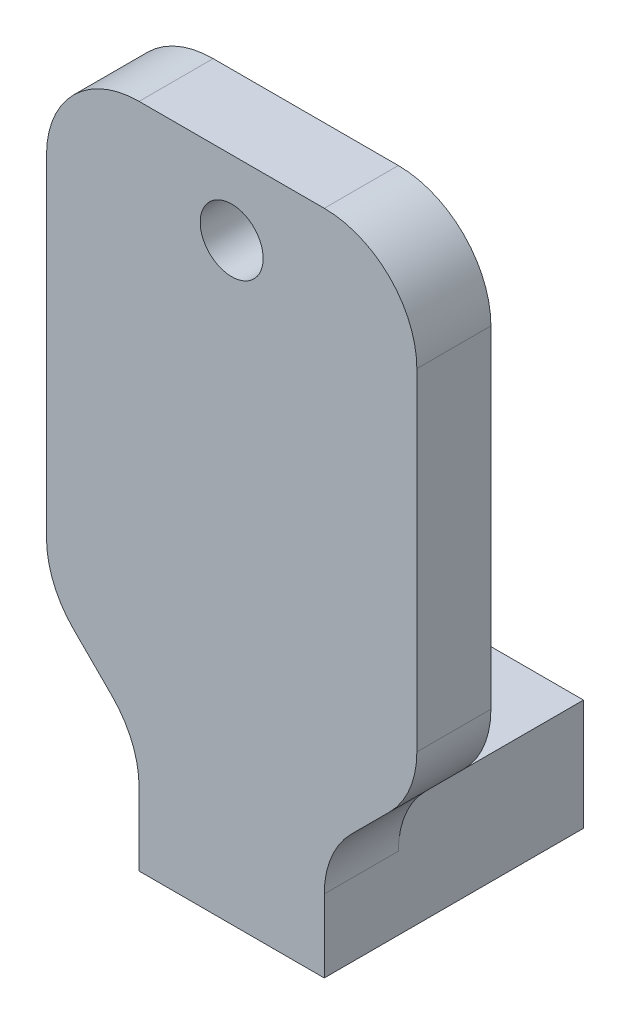
ISO-10303-21;
HEADER;
FILE_DESCRIPTION(('STEP AP214'),'2;1');
FILE_NAME('part.step','',(''),(''),'','','');
FILE_SCHEMA(('AUTOMOTIVE_DESIGN { 1 0 10303 214 1 1 1 1 }'));
ENDSEC;
DATA;
#1=APPLICATION_CONTEXT('core data for automotive mechanical design processes');
#2=APPLICATION_PROTOCOL_DEFINITION('international standard','automotive_design',2000,#1);
#3=PRODUCT_CONTEXT('',#1,'mechanical');
#4=PRODUCT('Part','Part','',(#3));
#5=PRODUCT_RELATED_PRODUCT_CATEGORY('part','',(#4));
#6=PRODUCT_DEFINITION_FORMATION('','',#4);
#7=PRODUCT_DEFINITION_CONTEXT('part definition',#1,'design');
#8=PRODUCT_DEFINITION('design','',#6,#7);
#9=PRODUCT_DEFINITION_SHAPE('','',#8);
#10=(LENGTH_UNIT() NAMED_UNIT(*) SI_UNIT(.MILLI.,.METRE.));
#11=(NAMED_UNIT(*) PLANE_ANGLE_UNIT() SI_UNIT($,.RADIAN.));
#12=(NAMED_UNIT(*) SI_UNIT($,.STERADIAN.) SOLID_ANGLE_UNIT());
#13=UNCERTAINTY_MEASURE_WITH_UNIT(LENGTH_MEASURE(1.E-05),#10,'distance_accuracy_value','');
#14=(GEOMETRIC_REPRESENTATION_CONTEXT(3) GLOBAL_UNCERTAINTY_ASSIGNED_CONTEXT((#13)) GLOBAL_UNIT_ASSIGNED_CONTEXT((#10,
#11,#12)) REPRESENTATION_CONTEXT('',''));
#15=CARTESIAN_POINT('',(0.,0.,0.));
#16=DIRECTION('',(0.,0.,1.));
#17=DIRECTION('',(1.,0.,0.));
#18=AXIS2_PLACEMENT_3D('',#15,#16,#17);
#19=CARTESIAN_POINT('',(0.,0.,4.));
#20=DIRECTION('',(0.,0.,1.));
#21=DIRECTION('',(1.,0.,0.));
#22=AXIS2_PLACEMENT_3D('',#19,#20,#21);
#23=PLANE('',#22);
#24=DIRECTION('',(0.,1.,0.));
#25=VECTOR('',#24,1.);
#26=CARTESIAN_POINT('',(10.,-15.,4.));
#27=LINE('',#26,#25);
#28=CARTESIAN_POINT('',(10.,-7.92893218813452,4.));
#29=VERTEX_POINT('',#28);
#30=CARTESIAN_POINT('',(10.,10.,4.));
#31=VERTEX_POINT('',#30);
#32=EDGE_CURVE('E204',#29,#31,#27,.T.);
#33=ORIENTED_EDGE('',*,*,#32,.T.);
#34=CARTESIAN_POINT('',(5.,10.,4.));
#35=DIRECTION('',(0.,0.,1.));
#36=DIRECTION('',(1.,0.,0.));
#37=AXIS2_PLACEMENT_3D('',#34,#35,#36);
#38=CIRCLE('',#37,5.);
#39=CARTESIAN_POINT('',(5.,15.,4.));
#40=VERTEX_POINT('',#39);
#41=EDGE_CURVE('E256',#31,#40,#38,.T.);
#42=ORIENTED_EDGE('',*,*,#41,.T.);
#43=DIRECTION('',(-1.,0.,0.));
#44=VECTOR('',#43,1.);
#45=CARTESIAN_POINT('',(10.,15.,4.));
#46=LINE('',#45,#44);
#47=CARTESIAN_POINT('',(-5.,15.,4.));
#48=VERTEX_POINT('',#47);
#49=EDGE_CURVE('E208',#40,#48,#46,.T.);
#50=ORIENTED_EDGE('',*,*,#49,.T.);
#51=CARTESIAN_POINT('',(-5.,10.,4.));
#52=DIRECTION('',(0.,0.,1.));
#53=DIRECTION('',(1.,0.,0.));
#54=AXIS2_PLACEMENT_3D('',#51,#52,#53);
#55=CIRCLE('',#54,5.);
#56=CARTESIAN_POINT('',(-10.,10.,4.));
#57=VERTEX_POINT('',#56);
#58=EDGE_CURVE('E254',#48,#57,#55,.T.);
#59=ORIENTED_EDGE('',*,*,#58,.T.);
#60=DIRECTION('',(0.,-1.,0.));
#61=VECTOR('',#60,1.);
#62=CARTESIAN_POINT('',(-10.,-15.,4.));
#63=LINE('',#62,#61);
#64=CARTESIAN_POINT('',(-10.,-7.92893218813451,4.));
#65=VERTEX_POINT('',#64);
#66=EDGE_CURVE('E201',#57,#65,#63,.T.);
#67=ORIENTED_EDGE('',*,*,#66,.T.);
#68=CARTESIAN_POINT('',(-5.,-7.92893218813451,4.));
#69=DIRECTION('',(0.,0.,1.));
#70=DIRECTION('',(1.,0.,0.));
#71=AXIS2_PLACEMENT_3D('',#68,#69,#70);
#72=CIRCLE('',#71,5.);
#73=CARTESIAN_POINT('',(-8.53553390593275,-11.4644660940672,4.));
#74=VERTEX_POINT('',#73);
#75=EDGE_CURVE('E252',#65,#74,#72,.T.);
#76=ORIENTED_EDGE('',*,*,#75,.T.);
#77=DIRECTION('',(-0.707106781186547,0.707106781186549,0.));
#78=VECTOR('',#77,1.);
#79=CARTESIAN_POINT('',(-10.,-9.99999999999998,4.));
#80=LINE('',#79,#78);
#81=CARTESIAN_POINT('',(-6.46446609406726,-13.5355339059327,4.));
#82=VERTEX_POINT('',#81);
#83=EDGE_CURVE('E229',#74,#82,#80,.F.);
#84=ORIENTED_EDGE('',*,*,#83,.T.);
#85=CARTESIAN_POINT('',(-10.,-17.0710678118655,4.));
#86=DIRECTION('',(0.,0.,1.));
#87=DIRECTION('',(1.,0.,0.));
#88=AXIS2_PLACEMENT_3D('',#85,#86,#87);
#89=CIRCLE('',#88,5.);
#90=CARTESIAN_POINT('',(-5.,-17.0710678118655,4.));
#91=VERTEX_POINT('',#90);
#92=EDGE_CURVE('E282',#82,#91,#89,.F.);
#93=ORIENTED_EDGE('',*,*,#92,.T.);
#94=DIRECTION('',(0.,-1.,0.));
#95=VECTOR('',#94,1.);
#96=CARTESIAN_POINT('',(-5.,-15.,4.));
#97=LINE('',#96,#95);
#98=CARTESIAN_POINT('',(-5.,-21.,4.));
#99=VERTEX_POINT('',#98);
#100=EDGE_CURVE('E187',#91,#99,#97,.T.);
#101=ORIENTED_EDGE('',*,*,#100,.T.);
#102=DIRECTION('',(1.,0.,0.));
#103=VECTOR('',#102,1.);
#104=CARTESIAN_POINT('',(-5.,-21.,4.));
#105=LINE('',#104,#103);
#106=CARTESIAN_POINT('',(5.,-21.,4.));
#107=VERTEX_POINT('',#106);
#108=EDGE_CURVE('E160',#99,#107,#105,.T.);
#109=ORIENTED_EDGE('',*,*,#108,.T.);
#110=DIRECTION('',(0.,1.,0.));
#111=VECTOR('',#110,1.);
#112=CARTESIAN_POINT('',(5.,-15.,4.));
#113=LINE('',#112,#111);
#114=CARTESIAN_POINT('',(5.,-17.0710678118655,4.));
#115=VERTEX_POINT('',#114);
#116=EDGE_CURVE('E180',#107,#115,#113,.T.);
#117=ORIENTED_EDGE('',*,*,#116,.T.);
#118=CARTESIAN_POINT('',(10.,-17.0710678118655,4.));
#119=DIRECTION('',(0.,0.,1.));
#120=DIRECTION('',(1.,0.,0.));
#121=AXIS2_PLACEMENT_3D('',#118,#119,#120);
#122=CIRCLE('',#121,5.);
#123=CARTESIAN_POINT('',(6.46446609406727,-13.5355339059327,4.));
#124=VERTEX_POINT('',#123);
#125=EDGE_CURVE('E51',#115,#124,#122,.F.);
#126=ORIENTED_EDGE('',*,*,#125,.T.);
#127=DIRECTION('',(-0.707106781186549,-0.707106781186546,0.));
#128=VECTOR('',#127,1.);
#129=CARTESIAN_POINT('',(9.99999999999998,-10.,4.));
#130=LINE('',#129,#128);
#131=CARTESIAN_POINT('',(8.53553390593273,-11.4644660940673,4.));
#132=VERTEX_POINT('',#131);
#133=EDGE_CURVE('E226',#124,#132,#130,.F.);
#134=ORIENTED_EDGE('',*,*,#133,.T.);
#135=CARTESIAN_POINT('',(5.,-7.92893218813452,4.));
#136=DIRECTION('',(0.,0.,1.));
#137=DIRECTION('',(1.,0.,0.));
#138=AXIS2_PLACEMENT_3D('',#135,#136,#137);
#139=CIRCLE('',#138,5.);
#140=EDGE_CURVE('E250',#132,#29,#139,.T.);
#141=ORIENTED_EDGE('',*,*,#140,.T.);
#142=EDGE_LOOP('',(#33,#42,#50,#59,#67,#76,#84,#93,#101,#109,#117,#126,#134,#141));
#143=FACE_BOUND('',#142,.T.);
#144=CARTESIAN_POINT('',(0.,11.,4.));
#145=DIRECTION('',(0.,0.,1.));
#146=DIRECTION('',(1.,0.,0.));
#147=AXIS2_PLACEMENT_3D('',#144,#145,#146);
#148=CIRCLE('',#147,1.7);
#149=CARTESIAN_POINT('',(1.7,11.,4.));
#150=VERTEX_POINT('',#149);
#151=EDGE_CURVE('E195',#150,#150,#148,.T.);
#152=ORIENTED_EDGE('',*,*,#151,.F.);
#153=EDGE_LOOP('',(#152));
#154=FACE_BOUND('',#153,.T.);
#155=ADVANCED_FACE('F43',(#143,#154),#23,.T.);
#156=CARTESIAN_POINT('',(0.,0.,0.));
#157=DIRECTION('',(0.,0.,1.));
#158=DIRECTION('',(1.,0.,0.));
#159=AXIS2_PLACEMENT_3D('',#156,#157,#158);
#160=PLANE('',#159);
#161=DIRECTION('',(-1.,0.,0.));
#162=VECTOR('',#161,1.);
#163=CARTESIAN_POINT('',(10.,15.,0.));
#164=LINE('',#163,#162);
#165=CARTESIAN_POINT('',(5.,15.,0.));
#166=VERTEX_POINT('',#165);
#167=CARTESIAN_POINT('',(-5.,15.,0.));
#168=VERTEX_POINT('',#167);
#169=EDGE_CURVE('E205',#166,#168,#164,.T.);
#170=ORIENTED_EDGE('',*,*,#169,.F.);
#171=CARTESIAN_POINT('',(5.,10.,0.));
#172=DIRECTION('',(0.,0.,1.));
#173=DIRECTION('',(1.,0.,0.));
#174=AXIS2_PLACEMENT_3D('',#171,#172,#173);
#175=CIRCLE('',#174,5.);
#176=CARTESIAN_POINT('',(10.,10.,0.));
#177=VERTEX_POINT('',#176);
#178=EDGE_CURVE('E243',#166,#177,#175,.F.);
#179=ORIENTED_EDGE('',*,*,#178,.T.);
#180=DIRECTION('',(0.,1.,0.));
#181=VECTOR('',#180,1.);
#182=CARTESIAN_POINT('',(10.,-15.,0.));
#183=LINE('',#182,#181);
#184=CARTESIAN_POINT('',(10.,-7.92893218813452,0.));
#185=VERTEX_POINT('',#184);
#186=EDGE_CURVE('E217',#185,#177,#183,.T.);
#187=ORIENTED_EDGE('',*,*,#186,.F.);
#188=CARTESIAN_POINT('',(5.,-7.92893218813452,0.));
#189=DIRECTION('',(0.,0.,1.));
#190=DIRECTION('',(1.,0.,0.));
#191=AXIS2_PLACEMENT_3D('',#188,#189,#190);
#192=CIRCLE('',#191,5.);
#193=CARTESIAN_POINT('',(8.53553390593273,-11.4644660940673,0.));
#194=VERTEX_POINT('',#193);
#195=EDGE_CURVE('E237',#185,#194,#192,.F.);
#196=ORIENTED_EDGE('',*,*,#195,.T.);
#197=DIRECTION('',(0.707106781186549,0.707106781186546,0.));
#198=VECTOR('',#197,1.);
#199=CARTESIAN_POINT('',(10.,-10.,0.));
#200=LINE('',#199,#198);
#201=CARTESIAN_POINT('',(6.46446609406727,-13.5355339059327,0.));
#202=VERTEX_POINT('',#201);
#203=EDGE_CURVE('E211',#194,#202,#200,.F.);
#204=ORIENTED_EDGE('',*,*,#203,.T.);
#205=CARTESIAN_POINT('',(10.,-17.0710678118655,0.));
#206=DIRECTION('',(0.,0.,1.));
#207=DIRECTION('',(1.,0.,0.));
#208=AXIS2_PLACEMENT_3D('',#205,#206,#207);
#209=CIRCLE('',#208,5.);
#210=CARTESIAN_POINT('',(5.,-17.0710678118655,0.));
#211=VERTEX_POINT('',#210);
#212=EDGE_CURVE('E11',#202,#211,#209,.T.);
#213=ORIENTED_EDGE('',*,*,#212,.T.);
#214=DIRECTION('',(0.,-1.,0.));
#215=VECTOR('',#214,1.);
#216=CARTESIAN_POINT('',(5.,-15.,0.));
#217=LINE('',#216,#215);
#218=CARTESIAN_POINT('',(5.,-15.,0.));
#219=VERTEX_POINT('',#218);
#220=EDGE_CURVE('E57',#219,#211,#217,.T.);
#221=ORIENTED_EDGE('',*,*,#220,.F.);
#222=DIRECTION('',(1.,0.,0.));
#223=VECTOR('',#222,1.);
#224=CARTESIAN_POINT('',(10.,-15.,0.));
#225=LINE('',#224,#223);
#226=CARTESIAN_POINT('',(-5.,-15.,0.));
#227=VERTEX_POINT('',#226);
#228=EDGE_CURVE('E214',#227,#219,#225,.T.);
#229=ORIENTED_EDGE('',*,*,#228,.F.);
#230=DIRECTION('',(0.,1.,0.));
#231=VECTOR('',#230,1.);
#232=CARTESIAN_POINT('',(-5.,-15.,0.));
#233=LINE('',#232,#231);
#234=CARTESIAN_POINT('',(-5.,-17.0710678118655,0.));
#235=VERTEX_POINT('',#234);
#236=EDGE_CURVE('E269',#235,#227,#233,.T.);
#237=ORIENTED_EDGE('',*,*,#236,.F.);
#238=CARTESIAN_POINT('',(-10.,-17.0710678118655,0.));
#239=DIRECTION('',(0.,0.,1.));
#240=DIRECTION('',(1.,0.,0.));
#241=AXIS2_PLACEMENT_3D('',#238,#239,#240);
#242=CIRCLE('',#241,5.);
#243=CARTESIAN_POINT('',(-6.46446609406726,-13.5355339059327,0.));
#244=VERTEX_POINT('',#243);
#245=EDGE_CURVE('E284',#235,#244,#242,.T.);
#246=ORIENTED_EDGE('',*,*,#245,.T.);
#247=DIRECTION('',(0.707106781186547,-0.707106781186549,0.));
#248=VECTOR('',#247,1.);
#249=CARTESIAN_POINT('',(-5.,-15.,0.));
#250=LINE('',#249,#248);
#251=CARTESIAN_POINT('',(-8.53553390593275,-11.4644660940672,0.));
#252=VERTEX_POINT('',#251);
#253=EDGE_CURVE('E223',#244,#252,#250,.F.);
#254=ORIENTED_EDGE('',*,*,#253,.T.);
#255=CARTESIAN_POINT('',(-5.,-7.92893218813451,0.));
#256=DIRECTION('',(0.,0.,1.));
#257=DIRECTION('',(1.,0.,0.));
#258=AXIS2_PLACEMENT_3D('',#255,#256,#257);
#259=CIRCLE('',#258,5.);
#260=CARTESIAN_POINT('',(-10.,-7.92893218813451,0.));
#261=VERTEX_POINT('',#260);
#262=EDGE_CURVE('E239',#252,#261,#259,.F.);
#263=ORIENTED_EDGE('',*,*,#262,.T.);
#264=DIRECTION('',(0.,-1.,0.));
#265=VECTOR('',#264,1.);
#266=CARTESIAN_POINT('',(-10.,-15.,0.));
#267=LINE('',#266,#265);
#268=CARTESIAN_POINT('',(-10.,10.,0.));
#269=VERTEX_POINT('',#268);
#270=EDGE_CURVE('E198',#269,#261,#267,.T.);
#271=ORIENTED_EDGE('',*,*,#270,.F.);
#272=CARTESIAN_POINT('',(-5.,10.,0.));
#273=DIRECTION('',(0.,0.,1.));
#274=DIRECTION('',(1.,0.,0.));
#275=AXIS2_PLACEMENT_3D('',#272,#273,#274);
#276=CIRCLE('',#275,5.);
#277=EDGE_CURVE('E241',#269,#168,#276,.F.);
#278=ORIENTED_EDGE('',*,*,#277,.T.);
#279=EDGE_LOOP('',(#170,#179,#187,#196,#204,#213,#221,#229,#237,#246,#254,#263,#271,#278));
#280=FACE_BOUND('',#279,.T.);
#281=CARTESIAN_POINT('',(0.,11.,0.));
#282=DIRECTION('',(0.,0.,1.));
#283=DIRECTION('',(1.,0.,0.));
#284=AXIS2_PLACEMENT_3D('',#281,#282,#283);
#285=CIRCLE('',#284,1.7);
#286=CARTESIAN_POINT('',(1.7,11.,0.));
#287=VERTEX_POINT('',#286);
#288=EDGE_CURVE('E191',#287,#287,#285,.T.);
#289=ORIENTED_EDGE('',*,*,#288,.T.);
#290=EDGE_LOOP('',(#289));
#291=FACE_BOUND('',#290,.T.);
#292=ADVANCED_FACE('F303',(#280,#291),#160,.F.);
#293=CARTESIAN_POINT('',(-10.,-15.,4.));
#294=DIRECTION('',(1.,0.,0.));
#295=DIRECTION('',(0.,1.,0.));
#296=AXIS2_PLACEMENT_3D('',#293,#294,#295);
#297=PLANE('',#296);
#298=ORIENTED_EDGE('',*,*,#66,.F.);
#299=DIRECTION('',(0.,0.,-1.));
#300=VECTOR('',#299,1.);
#301=CARTESIAN_POINT('',(-10.,10.,4.));
#302=LINE('',#301,#300);
#303=EDGE_CURVE('E261',#57,#269,#302,.T.);
#304=ORIENTED_EDGE('',*,*,#303,.T.);
#305=ORIENTED_EDGE('',*,*,#270,.T.);
#306=DIRECTION('',(0.,0.,-1.));
#307=VECTOR('',#306,1.);
#308=CARTESIAN_POINT('',(-10.,-7.92893218813451,4.));
#309=LINE('',#308,#307);
#310=EDGE_CURVE('E258',#261,#65,#309,.F.);
#311=ORIENTED_EDGE('',*,*,#310,.T.);
#312=EDGE_LOOP('',(#298,#304,#305,#311));
#313=FACE_BOUND('',#312,.T.);
#314=ADVANCED_FACE('F321',(#313),#297,.F.);
#315=CARTESIAN_POINT('',(10.,-15.,4.));
#316=DIRECTION('',(-1.,0.,0.));
#317=DIRECTION('',(0.,0.,1.));
#318=AXIS2_PLACEMENT_3D('',#315,#316,#317);
#319=PLANE('',#318);
#320=ORIENTED_EDGE('',*,*,#186,.T.);
#321=DIRECTION('',(0.,0.,-1.));
#322=VECTOR('',#321,1.);
#323=CARTESIAN_POINT('',(10.,10.,4.));
#324=LINE('',#323,#322);
#325=EDGE_CURVE('E248',#177,#31,#324,.F.);
#326=ORIENTED_EDGE('',*,*,#325,.T.);
#327=ORIENTED_EDGE('',*,*,#32,.F.);
#328=DIRECTION('',(0.,0.,1.));
#329=VECTOR('',#328,1.);
#330=CARTESIAN_POINT('',(10.,-7.92893218813452,0.));
#331=LINE('',#330,#329);
#332=EDGE_CURVE('E245',#29,#185,#331,.F.);
#333=ORIENTED_EDGE('',*,*,#332,.T.);
#334=EDGE_LOOP('',(#320,#326,#327,#333));
#335=FACE_BOUND('',#334,.T.);
#336=ADVANCED_FACE('F338',(#335),#319,.F.);
#337=CARTESIAN_POINT('',(10.,15.,4.));
#338=DIRECTION('',(0.,-1.,0.));
#339=DIRECTION('',(0.,0.,-1.));
#340=AXIS2_PLACEMENT_3D('',#337,#338,#339);
#341=PLANE('',#340);
#342=ORIENTED_EDGE('',*,*,#49,.F.);
#343=DIRECTION('',(0.,0.,-1.));
#344=VECTOR('',#343,1.);
#345=CARTESIAN_POINT('',(5.,15.,4.));
#346=LINE('',#345,#344);
#347=EDGE_CURVE('E234',#40,#166,#346,.T.);
#348=ORIENTED_EDGE('',*,*,#347,.T.);
#349=ORIENTED_EDGE('',*,*,#169,.T.);
#350=DIRECTION('',(0.,0.,-1.));
#351=VECTOR('',#350,1.);
#352=CARTESIAN_POINT('',(-5.,15.,4.));
#353=LINE('',#352,#351);
#354=EDGE_CURVE('E232',#168,#48,#353,.F.);
#355=ORIENTED_EDGE('',*,*,#354,.T.);
#356=EDGE_LOOP('',(#342,#348,#349,#355));
#357=FACE_BOUND('',#356,.T.);
#358=ADVANCED_FACE('F328',(#357),#341,.F.);
#359=CARTESIAN_POINT('',(0.,11.,4.));
#360=DIRECTION('',(0.,0.,-1.));
#361=DIRECTION('',(-1.,0.,0.));
#362=AXIS2_PLACEMENT_3D('',#359,#360,#361);
#363=CYLINDRICAL_SURFACE('',#362,1.7);
#364=ORIENTED_EDGE('',*,*,#151,.T.);
#365=EDGE_LOOP('',(#364));
#366=FACE_BOUND('',#365,.T.);
#367=ORIENTED_EDGE('',*,*,#288,.F.);
#368=EDGE_LOOP('',(#367));
#369=FACE_BOUND('',#368,.T.);
#370=ADVANCED_FACE('F354',(#366,#369),#363,.F.);
#371=CARTESIAN_POINT('',(-5.,-15.,-10.));
#372=DIRECTION('',(-1.,0.,0.));
#373=DIRECTION('',(0.,-1.,0.));
#374=AXIS2_PLACEMENT_3D('',#371,#372,#373);
#375=PLANE('',#374);
#376=ORIENTED_EDGE('',*,*,#100,.F.);
#377=DIRECTION('',(0.,0.,-1.));
#378=VECTOR('',#377,1.);
#379=CARTESIAN_POINT('',(-5.,-17.0710678118655,0.));
#380=LINE('',#379,#378);
#381=EDGE_CURVE('E271',#91,#235,#380,.T.);
#382=ORIENTED_EDGE('',*,*,#381,.T.);
#383=ORIENTED_EDGE('',*,*,#236,.T.);
#384=DIRECTION('',(0.,0.,1.));
#385=VECTOR('',#384,1.);
#386=CARTESIAN_POINT('',(-5.,-15.,-10.));
#387=LINE('',#386,#385);
#388=CARTESIAN_POINT('',(-5.,-15.,-10.));
#389=VERTEX_POINT('',#388);
#390=EDGE_CURVE('E179',#389,#227,#387,.T.);
#391=ORIENTED_EDGE('',*,*,#390,.F.);
#392=DIRECTION('',(0.,-1.,0.));
#393=VECTOR('',#392,1.);
#394=CARTESIAN_POINT('',(-5.,-15.,-10.));
#395=LINE('',#394,#393);
#396=CARTESIAN_POINT('',(-5.,-21.,-10.));
#397=VERTEX_POINT('',#396);
#398=EDGE_CURVE('E172',#389,#397,#395,.T.);
#399=ORIENTED_EDGE('',*,*,#398,.T.);
#400=DIRECTION('',(0.,0.,1.));
#401=VECTOR('',#400,1.);
#402=CARTESIAN_POINT('',(-5.,-21.,-10.));
#403=LINE('',#402,#401);
#404=EDGE_CURVE('E155',#397,#99,#403,.T.);
#405=ORIENTED_EDGE('',*,*,#404,.T.);
#406=EDGE_LOOP('',(#376,#382,#383,#391,#399,#405));
#407=FACE_BOUND('',#406,.T.);
#408=ADVANCED_FACE('F177',(#407),#375,.T.);
#409=CARTESIAN_POINT('',(-5.,-15.,-10.));
#410=DIRECTION('',(0.,1.,0.));
#411=DIRECTION('',(-1.,0.,0.));
#412=AXIS2_PLACEMENT_3D('',#409,#410,#411);
#413=PLANE('',#412);
#414=ORIENTED_EDGE('',*,*,#390,.T.);
#415=ORIENTED_EDGE('',*,*,#228,.T.);
#416=DIRECTION('',(0.,0.,1.));
#417=VECTOR('',#416,1.);
#418=CARTESIAN_POINT('',(5.,-15.,-10.));
#419=LINE('',#418,#417);
#420=CARTESIAN_POINT('',(5.,-15.,-10.));
#421=VERTEX_POINT('',#420);
#422=EDGE_CURVE('E192',#421,#219,#419,.T.);
#423=ORIENTED_EDGE('',*,*,#422,.F.);
#424=DIRECTION('',(-1.,0.,0.));
#425=VECTOR('',#424,1.);
#426=CARTESIAN_POINT('',(-5.,-15.,-10.));
#427=LINE('',#426,#425);
#428=EDGE_CURVE('E165',#421,#389,#427,.T.);
#429=ORIENTED_EDGE('',*,*,#428,.T.);
#430=EDGE_LOOP('',(#414,#415,#423,#429));
#431=FACE_BOUND('',#430,.T.);
#432=ADVANCED_FACE('F301',(#431),#413,.T.);
#433=CARTESIAN_POINT('',(5.,-15.,-10.));
#434=DIRECTION('',(1.,0.,0.));
#435=DIRECTION('',(0.,0.,-1.));
#436=AXIS2_PLACEMENT_3D('',#433,#434,#435);
#437=PLANE('',#436);
#438=ORIENTED_EDGE('',*,*,#220,.T.);
#439=DIRECTION('',(0.,0.,-1.));
#440=VECTOR('',#439,1.);
#441=CARTESIAN_POINT('',(5.,-17.0710678118655,4.));
#442=LINE('',#441,#440);
#443=EDGE_CURVE('E275',#211,#115,#442,.F.);
#444=ORIENTED_EDGE('',*,*,#443,.T.);
#445=ORIENTED_EDGE('',*,*,#116,.F.);
#446=DIRECTION('',(0.,0.,1.));
#447=VECTOR('',#446,1.);
#448=CARTESIAN_POINT('',(5.,-21.,-10.));
#449=LINE('',#448,#447);
#450=CARTESIAN_POINT('',(5.,-21.,-10.));
#451=VERTEX_POINT('',#450);
#452=EDGE_CURVE('E164',#451,#107,#449,.T.);
#453=ORIENTED_EDGE('',*,*,#452,.F.);
#454=DIRECTION('',(0.,1.,0.));
#455=VECTOR('',#454,1.);
#456=CARTESIAN_POINT('',(5.,-15.,-10.));
#457=LINE('',#456,#455);
#458=EDGE_CURVE('E175',#451,#421,#457,.T.);
#459=ORIENTED_EDGE('',*,*,#458,.T.);
#460=ORIENTED_EDGE('',*,*,#422,.T.);
#461=EDGE_LOOP('',(#438,#444,#445,#453,#459,#460));
#462=FACE_BOUND('',#461,.T.);
#463=ADVANCED_FACE('F299',(#462),#437,.T.);
#464=CARTESIAN_POINT('',(-5.,-21.,-10.));
#465=DIRECTION('',(0.,-1.,0.));
#466=DIRECTION('',(0.,0.,-1.));
#467=AXIS2_PLACEMENT_3D('',#464,#465,#466);
#468=PLANE('',#467);
#469=ORIENTED_EDGE('',*,*,#108,.F.);
#470=ORIENTED_EDGE('',*,*,#404,.F.);
#471=DIRECTION('',(1.,0.,0.));
#472=VECTOR('',#471,1.);
#473=CARTESIAN_POINT('',(-5.,-21.,-10.));
#474=LINE('',#473,#472);
#475=EDGE_CURVE('E158',#397,#451,#474,.T.);
#476=ORIENTED_EDGE('',*,*,#475,.T.);
#477=ORIENTED_EDGE('',*,*,#452,.T.);
#478=EDGE_LOOP('',(#469,#470,#476,#477));
#479=FACE_BOUND('',#478,.T.);
#480=ADVANCED_FACE('F157',(#479),#468,.T.);
#481=CARTESIAN_POINT('',(0.,0.,-10.));
#482=DIRECTION('',(0.,0.,1.));
#483=DIRECTION('',(1.,0.,0.));
#484=AXIS2_PLACEMENT_3D('',#481,#482,#483);
#485=PLANE('',#484);
#486=ORIENTED_EDGE('',*,*,#398,.F.);
#487=ORIENTED_EDGE('',*,*,#428,.F.);
#488=ORIENTED_EDGE('',*,*,#458,.F.);
#489=ORIENTED_EDGE('',*,*,#475,.F.);
#490=EDGE_LOOP('',(#486,#487,#488,#489));
#491=FACE_BOUND('',#490,.T.);
#492=ADVANCED_FACE('F170',(#491),#485,.F.);
#493=CARTESIAN_POINT('',(-5.,-15.,4.));
#494=DIRECTION('',(0.707106781186549,0.707106781186547,0.));
#495=DIRECTION('',(0.,0.,-1.));
#496=AXIS2_PLACEMENT_3D('',#493,#494,#495);
#497=PLANE('',#496);
#498=ORIENTED_EDGE('',*,*,#83,.F.);
#499=DIRECTION('',(0.,0.,1.));
#500=VECTOR('',#499,1.);
#501=CARTESIAN_POINT('',(-8.53553390593275,-11.4644660940672,0.));
#502=LINE('',#501,#500);
#503=EDGE_CURVE('E267',#74,#252,#502,.F.);
#504=ORIENTED_EDGE('',*,*,#503,.T.);
#505=ORIENTED_EDGE('',*,*,#253,.F.);
#506=DIRECTION('',(0.,0.,1.));
#507=VECTOR('',#506,1.);
#508=CARTESIAN_POINT('',(-6.46446609406726,-13.5355339059327,4.));
#509=LINE('',#508,#507);
#510=EDGE_CURVE('E264',#244,#82,#509,.T.);
#511=ORIENTED_EDGE('',*,*,#510,.T.);
#512=EDGE_LOOP('',(#498,#504,#505,#511));
#513=FACE_BOUND('',#512,.T.);
#514=ADVANCED_FACE('F313',(#513),#497,.F.);
#515=CARTESIAN_POINT('',(10.,-10.,4.));
#516=DIRECTION('',(-0.707106781186546,0.707106781186549,0.));
#517=DIRECTION('',(0.,0.,-1.));
#518=AXIS2_PLACEMENT_3D('',#515,#516,#517);
#519=PLANE('',#518);
#520=ORIENTED_EDGE('',*,*,#133,.F.);
#521=DIRECTION('',(0.,0.,1.));
#522=VECTOR('',#521,1.);
#523=CARTESIAN_POINT('',(6.46446609406727,-13.5355339059327,0.));
#524=LINE('',#523,#522);
#525=EDGE_CURVE('E280',#124,#202,#524,.F.);
#526=ORIENTED_EDGE('',*,*,#525,.T.);
#527=ORIENTED_EDGE('',*,*,#203,.F.);
#528=DIRECTION('',(0.,0.,-1.));
#529=VECTOR('',#528,1.);
#530=CARTESIAN_POINT('',(8.53553390593273,-11.4644660940673,4.));
#531=LINE('',#530,#529);
#532=EDGE_CURVE('E278',#194,#132,#531,.F.);
#533=ORIENTED_EDGE('',*,*,#532,.T.);
#534=EDGE_LOOP('',(#520,#526,#527,#533));
#535=FACE_BOUND('',#534,.T.);
#536=ADVANCED_FACE('F294',(#535),#519,.F.);
#537=CARTESIAN_POINT('',(5.,10.,4.));
#538=DIRECTION('',(0.,0.,-1.));
#539=DIRECTION('',(-1.,0.,0.));
#540=AXIS2_PLACEMENT_3D('',#537,#538,#539);
#541=CYLINDRICAL_SURFACE('',#540,5.);
#542=ORIENTED_EDGE('',*,*,#41,.F.);
#543=ORIENTED_EDGE('',*,*,#325,.F.);
#544=ORIENTED_EDGE('',*,*,#178,.F.);
#545=ORIENTED_EDGE('',*,*,#347,.F.);
#546=EDGE_LOOP('',(#542,#543,#544,#545));
#547=FACE_BOUND('',#546,.T.);
#548=ADVANCED_FACE('F334',(#547),#541,.T.);
#549=CARTESIAN_POINT('',(-5.,10.,4.));
#550=DIRECTION('',(0.,0.,-1.));
#551=DIRECTION('',(-1.,0.,0.));
#552=AXIS2_PLACEMENT_3D('',#549,#550,#551);
#553=CYLINDRICAL_SURFACE('',#552,5.);
#554=ORIENTED_EDGE('',*,*,#58,.F.);
#555=ORIENTED_EDGE('',*,*,#354,.F.);
#556=ORIENTED_EDGE('',*,*,#277,.F.);
#557=ORIENTED_EDGE('',*,*,#303,.F.);
#558=EDGE_LOOP('',(#554,#555,#556,#557));
#559=FACE_BOUND('',#558,.T.);
#560=ADVANCED_FACE('F331',(#559),#553,.T.);
#561=CARTESIAN_POINT('',(-5.,-7.92893218813451,4.));
#562=DIRECTION('',(0.,0.,1.));
#563=DIRECTION('',(1.,0.,0.));
#564=AXIS2_PLACEMENT_3D('',#561,#562,#563);
#565=CYLINDRICAL_SURFACE('',#564,5.);
#566=ORIENTED_EDGE('',*,*,#262,.F.);
#567=ORIENTED_EDGE('',*,*,#503,.F.);
#568=ORIENTED_EDGE('',*,*,#75,.F.);
#569=ORIENTED_EDGE('',*,*,#310,.F.);
#570=EDGE_LOOP('',(#566,#567,#568,#569));
#571=FACE_BOUND('',#570,.T.);
#572=ADVANCED_FACE('F319',(#571),#565,.T.);
#573=CARTESIAN_POINT('',(-10.,-17.0710678118655,4.));
#574=DIRECTION('',(0.,0.,1.));
#575=DIRECTION('',(1.,0.,0.));
#576=AXIS2_PLACEMENT_3D('',#573,#574,#575);
#577=CYLINDRICAL_SURFACE('',#576,5.);
#578=ORIENTED_EDGE('',*,*,#245,.F.);
#579=ORIENTED_EDGE('',*,*,#381,.F.);
#580=ORIENTED_EDGE('',*,*,#92,.F.);
#581=ORIENTED_EDGE('',*,*,#510,.F.);
#582=EDGE_LOOP('',(#578,#579,#580,#581));
#583=FACE_BOUND('',#582,.T.);
#584=ADVANCED_FACE('F310',(#583),#577,.F.);
#585=CARTESIAN_POINT('',(10.,-17.0710678118655,-10.));
#586=DIRECTION('',(0.,0.,1.));
#587=DIRECTION('',(1.,0.,0.));
#588=AXIS2_PLACEMENT_3D('',#585,#586,#587);
#589=CYLINDRICAL_SURFACE('',#588,5.);
#590=ORIENTED_EDGE('',*,*,#212,.F.);
#591=ORIENTED_EDGE('',*,*,#525,.F.);
#592=ORIENTED_EDGE('',*,*,#125,.F.);
#593=ORIENTED_EDGE('',*,*,#443,.F.);
#594=EDGE_LOOP('',(#590,#591,#592,#593));
#595=FACE_BOUND('',#594,.T.);
#596=ADVANCED_FACE('F297',(#595),#589,.F.);
#597=CARTESIAN_POINT('',(5.,-7.92893218813452,4.));
#598=DIRECTION('',(0.,0.,-1.));
#599=DIRECTION('',(-1.,0.,0.));
#600=AXIS2_PLACEMENT_3D('',#597,#598,#599);
#601=CYLINDRICAL_SURFACE('',#600,5.);
#602=ORIENTED_EDGE('',*,*,#140,.F.);
#603=ORIENTED_EDGE('',*,*,#532,.F.);
#604=ORIENTED_EDGE('',*,*,#195,.F.);
#605=ORIENTED_EDGE('',*,*,#332,.F.);
#606=EDGE_LOOP('',(#602,#603,#604,#605));
#607=FACE_BOUND('',#606,.T.);
#608=ADVANCED_FACE('F45',(#607),#601,.T.);
#609=CLOSED_SHELL('',(#155,#292,#314,#336,#358,#370,#408,#432,#463,#480,#492,#514,#536,#548,
#560,#572,#584,#596,#608));
#610=MANIFOLD_SOLID_BREP('B2',#609);
#611=ADVANCED_BREP_SHAPE_REPRESENTATION('',(#18,#610),#14);
#612=SHAPE_DEFINITION_REPRESENTATION(#9,#611);
ENDSEC;
END-ISO-10303-21;
